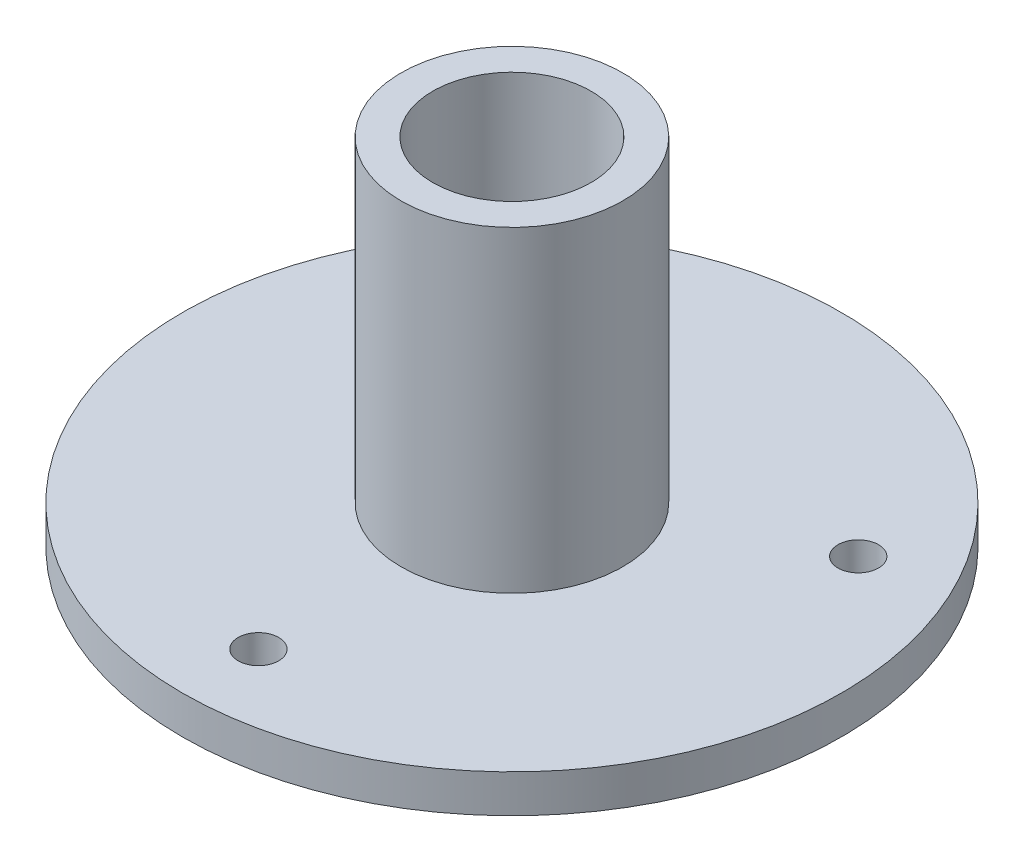
ISO-10303-21;
HEADER;
FILE_DESCRIPTION(('STEP AP214'),'2;1');
FILE_NAME('part.step','',(''),(''),'','','');
FILE_SCHEMA(('AUTOMOTIVE_DESIGN { 1 0 10303 214 1 1 1 1 }'));
ENDSEC;
DATA;
#1=APPLICATION_CONTEXT('core data for automotive mechanical design processes');
#2=APPLICATION_PROTOCOL_DEFINITION('international standard','automotive_design',2000,#1);
#3=PRODUCT_CONTEXT('',#1,'mechanical');
#4=PRODUCT('Part','Part','',(#3));
#5=PRODUCT_RELATED_PRODUCT_CATEGORY('part','',(#4));
#6=PRODUCT_DEFINITION_FORMATION('','',#4);
#7=PRODUCT_DEFINITION_CONTEXT('part definition',#1,'design');
#8=PRODUCT_DEFINITION('design','',#6,#7);
#9=PRODUCT_DEFINITION_SHAPE('','',#8);
#10=(LENGTH_UNIT() NAMED_UNIT(*) SI_UNIT(.MILLI.,.METRE.));
#11=(NAMED_UNIT(*) PLANE_ANGLE_UNIT() SI_UNIT($,.RADIAN.));
#12=(NAMED_UNIT(*) SI_UNIT($,.STERADIAN.) SOLID_ANGLE_UNIT());
#13=UNCERTAINTY_MEASURE_WITH_UNIT(LENGTH_MEASURE(1.E-05),#10,'distance_accuracy_value','');
#14=(GEOMETRIC_REPRESENTATION_CONTEXT(3) GLOBAL_UNCERTAINTY_ASSIGNED_CONTEXT((#13)) GLOBAL_UNIT_ASSIGNED_CONTEXT((#10,
#11,#12)) REPRESENTATION_CONTEXT('',''));
#15=CARTESIAN_POINT('',(0.,0.,0.));
#16=DIRECTION('',(0.,0.,1.));
#17=DIRECTION('',(1.,0.,0.));
#18=AXIS2_PLACEMENT_3D('',#15,#16,#17);
#19=CARTESIAN_POINT('',(0.,3.,0.));
#20=DIRECTION('',(0.,-1.,0.));
#21=DIRECTION('',(0.,0.,-1.));
#22=AXIS2_PLACEMENT_3D('',#19,#20,#21);
#23=CYLINDRICAL_SURFACE('',#22,26.);
#24=CARTESIAN_POINT('',(0.,3.,0.));
#25=DIRECTION('',(0.,1.,0.));
#26=DIRECTION('',(0.,0.,1.));
#27=AXIS2_PLACEMENT_3D('',#24,#25,#26);
#28=CIRCLE('',#27,26.);
#29=CARTESIAN_POINT('',(0.,3.,26.));
#30=VERTEX_POINT('',#29);
#31=EDGE_CURVE('E48',#30,#30,#28,.T.);
#32=ORIENTED_EDGE('',*,*,#31,.F.);
#33=EDGE_LOOP('',(#32));
#34=FACE_BOUND('',#33,.T.);
#35=CARTESIAN_POINT('',(0.,0.,0.));
#36=DIRECTION('',(0.,1.,0.));
#37=DIRECTION('',(0.,0.,1.));
#38=AXIS2_PLACEMENT_3D('',#35,#36,#37);
#39=CIRCLE('',#38,26.);
#40=CARTESIAN_POINT('',(0.,0.,26.));
#41=VERTEX_POINT('',#40);
#42=EDGE_CURVE('E43',#41,#41,#39,.T.);
#43=ORIENTED_EDGE('',*,*,#42,.T.);
#44=EDGE_LOOP('',(#43));
#45=FACE_BOUND('',#44,.T.);
#46=ADVANCED_FACE('F40',(#34,#45),#23,.T.);
#47=CARTESIAN_POINT('',(0.,3.,0.));
#48=DIRECTION('',(0.,1.,0.));
#49=DIRECTION('',(0.,0.,1.));
#50=AXIS2_PLACEMENT_3D('',#47,#48,#49);
#51=PLANE('',#50);
#52=CARTESIAN_POINT('',(0.,3.,20.));
#53=DIRECTION('',(0.,1.,0.));
#54=DIRECTION('',(0.,0.,1.));
#55=AXIS2_PLACEMENT_3D('',#52,#53,#54);
#56=CIRCLE('',#55,1.6);
#57=CARTESIAN_POINT('',(0.,3.,18.4));
#58=VERTEX_POINT('',#57);
#59=EDGE_CURVE('E67',#58,#58,#56,.F.);
#60=ORIENTED_EDGE('',*,*,#59,.T.);
#61=EDGE_LOOP('',(#60));
#62=FACE_BOUND('',#61,.T.);
#63=CARTESIAN_POINT('',(17.3205080756888,3.,-10.));
#64=DIRECTION('',(0.,1.,0.));
#65=DIRECTION('',(0.,0.,1.));
#66=AXIS2_PLACEMENT_3D('',#63,#64,#65);
#67=CIRCLE('',#66,1.6);
#68=CARTESIAN_POINT('',(17.3205080756888,3.,-11.6));
#69=VERTEX_POINT('',#68);
#70=EDGE_CURVE('E72',#69,#69,#67,.F.);
#71=ORIENTED_EDGE('',*,*,#70,.T.);
#72=EDGE_LOOP('',(#71));
#73=FACE_BOUND('',#72,.T.);
#74=CARTESIAN_POINT('',(-17.3205080756888,3.,-10.));
#75=DIRECTION('',(0.,1.,0.));
#76=DIRECTION('',(0.,0.,1.));
#77=AXIS2_PLACEMENT_3D('',#74,#75,#76);
#78=CIRCLE('',#77,1.6);
#79=CARTESIAN_POINT('',(-17.3205080756888,3.,-11.6));
#80=VERTEX_POINT('',#79);
#81=EDGE_CURVE('E73',#80,#80,#78,.F.);
#82=ORIENTED_EDGE('',*,*,#81,.T.);
#83=EDGE_LOOP('',(#82));
#84=FACE_BOUND('',#83,.T.);
#85=CARTESIAN_POINT('',(0.,3.,0.));
#86=DIRECTION('',(0.,1.,0.));
#87=DIRECTION('',(0.,0.,1.));
#88=AXIS2_PLACEMENT_3D('',#85,#86,#87);
#89=CIRCLE('',#88,8.75);
#90=CARTESIAN_POINT('',(0.,3.,8.75));
#91=VERTEX_POINT('',#90);
#92=EDGE_CURVE('E10',#91,#91,#89,.T.);
#93=ORIENTED_EDGE('',*,*,#92,.F.);
#94=EDGE_LOOP('',(#93));
#95=FACE_BOUND('',#94,.T.);
#96=ORIENTED_EDGE('',*,*,#31,.T.);
#97=EDGE_LOOP('',(#96));
#98=FACE_BOUND('',#97,.T.);
#99=ADVANCED_FACE('F99',(#62,#73,#84,#95,#98),#51,.T.);
#100=CARTESIAN_POINT('',(0.,0.,0.));
#101=DIRECTION('',(0.,1.,0.));
#102=DIRECTION('',(0.,0.,1.));
#103=AXIS2_PLACEMENT_3D('',#100,#101,#102);
#104=PLANE('',#103);
#105=CARTESIAN_POINT('',(0.,0.,20.));
#106=DIRECTION('',(0.,-1.,0.));
#107=DIRECTION('',(0.,0.,-1.));
#108=AXIS2_PLACEMENT_3D('',#105,#106,#107);
#109=CIRCLE('',#108,1.6);
#110=CARTESIAN_POINT('',(0.,0.,18.4));
#111=VERTEX_POINT('',#110);
#112=EDGE_CURVE('E81',#111,#111,#109,.T.);
#113=ORIENTED_EDGE('',*,*,#112,.F.);
#114=EDGE_LOOP('',(#113));
#115=FACE_BOUND('',#114,.T.);
#116=CARTESIAN_POINT('',(17.3205080756888,0.,-10.));
#117=DIRECTION('',(0.,-1.,0.));
#118=DIRECTION('',(0.,0.,-1.));
#119=AXIS2_PLACEMENT_3D('',#116,#117,#118);
#120=CIRCLE('',#119,1.6);
#121=CARTESIAN_POINT('',(17.3205080756888,0.,-11.6));
#122=VERTEX_POINT('',#121);
#123=EDGE_CURVE('E77',#122,#122,#120,.T.);
#124=ORIENTED_EDGE('',*,*,#123,.F.);
#125=EDGE_LOOP('',(#124));
#126=FACE_BOUND('',#125,.T.);
#127=CARTESIAN_POINT('',(-17.3205080756888,0.,-10.));
#128=DIRECTION('',(0.,-1.,0.));
#129=DIRECTION('',(0.,0.,-1.));
#130=AXIS2_PLACEMENT_3D('',#127,#128,#129);
#131=CIRCLE('',#130,1.6);
#132=CARTESIAN_POINT('',(-17.3205080756888,0.,-11.6));
#133=VERTEX_POINT('',#132);
#134=EDGE_CURVE('E68',#133,#133,#131,.T.);
#135=ORIENTED_EDGE('',*,*,#134,.F.);
#136=EDGE_LOOP('',(#135));
#137=FACE_BOUND('',#136,.T.);
#138=CARTESIAN_POINT('',(0.,0.,0.));
#139=DIRECTION('',(0.,1.,0.));
#140=DIRECTION('',(0.,0.,1.));
#141=AXIS2_PLACEMENT_3D('',#138,#139,#140);
#142=CIRCLE('',#141,6.25);
#143=CARTESIAN_POINT('',(0.,0.,6.25));
#144=VERTEX_POINT('',#143);
#145=EDGE_CURVE('E59',#144,#144,#142,.F.);
#146=ORIENTED_EDGE('',*,*,#145,.F.);
#147=EDGE_LOOP('',(#146));
#148=FACE_BOUND('',#147,.T.);
#149=ORIENTED_EDGE('',*,*,#42,.F.);
#150=EDGE_LOOP('',(#149));
#151=FACE_BOUND('',#150,.T.);
#152=ADVANCED_FACE('F95',(#115,#126,#137,#148,#151),#104,.F.);
#153=CARTESIAN_POINT('',(0.,28.,0.));
#154=DIRECTION('',(0.,-1.,0.));
#155=DIRECTION('',(0.,0.,-1.));
#156=AXIS2_PLACEMENT_3D('',#153,#154,#155);
#157=CYLINDRICAL_SURFACE('',#156,8.75);
#158=CARTESIAN_POINT('',(0.,28.,0.));
#159=DIRECTION('',(0.,1.,0.));
#160=DIRECTION('',(0.,0.,1.));
#161=AXIS2_PLACEMENT_3D('',#158,#159,#160);
#162=CIRCLE('',#161,8.75);
#163=CARTESIAN_POINT('',(0.,28.,8.75));
#164=VERTEX_POINT('',#163);
#165=EDGE_CURVE('E55',#164,#164,#162,.T.);
#166=ORIENTED_EDGE('',*,*,#165,.F.);
#167=EDGE_LOOP('',(#166));
#168=FACE_BOUND('',#167,.T.);
#169=ORIENTED_EDGE('',*,*,#92,.T.);
#170=EDGE_LOOP('',(#169));
#171=FACE_BOUND('',#170,.T.);
#172=ADVANCED_FACE('F98',(#168,#171),#157,.T.);
#173=CARTESIAN_POINT('',(0.,28.,0.));
#174=DIRECTION('',(0.,1.,0.));
#175=DIRECTION('',(0.,0.,1.));
#176=AXIS2_PLACEMENT_3D('',#173,#174,#175);
#177=PLANE('',#176);
#178=CARTESIAN_POINT('',(0.,28.,0.));
#179=DIRECTION('',(0.,1.,0.));
#180=DIRECTION('',(0.,0.,1.));
#181=AXIS2_PLACEMENT_3D('',#178,#179,#180);
#182=CIRCLE('',#181,6.25);
#183=CARTESIAN_POINT('',(0.,28.,6.25));
#184=VERTEX_POINT('',#183);
#185=EDGE_CURVE('E63',#184,#184,#182,.T.);
#186=ORIENTED_EDGE('',*,*,#185,.F.);
#187=EDGE_LOOP('',(#186));
#188=FACE_BOUND('',#187,.T.);
#189=ORIENTED_EDGE('',*,*,#165,.T.);
#190=EDGE_LOOP('',(#189));
#191=FACE_BOUND('',#190,.T.);
#192=ADVANCED_FACE('F125',(#188,#191),#177,.T.);
#193=CARTESIAN_POINT('',(0.,-17.6776695296637,0.));
#194=DIRECTION('',(0.,1.,0.));
#195=DIRECTION('',(0.,0.,1.));
#196=AXIS2_PLACEMENT_3D('',#193,#194,#195);
#197=CYLINDRICAL_SURFACE('',#196,6.25);
#198=ORIENTED_EDGE('',*,*,#145,.T.);
#199=EDGE_LOOP('',(#198));
#200=FACE_BOUND('',#199,.T.);
#201=ORIENTED_EDGE('',*,*,#185,.T.);
#202=EDGE_LOOP('',(#201));
#203=FACE_BOUND('',#202,.T.);
#204=ADVANCED_FACE('F129',(#200,#203),#197,.F.);
#205=CARTESIAN_POINT('',(-17.3205080756888,7.52548339959391,-10.));
#206=DIRECTION('',(0.,-1.,0.));
#207=DIRECTION('',(0.,0.,-1.));
#208=AXIS2_PLACEMENT_3D('',#205,#206,#207);
#209=CYLINDRICAL_SURFACE('',#208,1.6);
#210=CARTESIAN_POINT('',(-17.3205080756888,0.,-11.6));
#211=CARTESIAN_POINT('',(-17.3205080756888,0.03125,-11.6));
#212=CARTESIAN_POINT('',(-17.3205080756888,0.0625000000000001,-11.6));
#213=CARTESIAN_POINT('',(-17.3205080756888,0.125,-11.6));
#214=CARTESIAN_POINT('',(-17.3205080756888,0.15625,-11.6));
#215=CARTESIAN_POINT('',(-17.3205080756888,0.21875,-11.6));
#216=CARTESIAN_POINT('',(-17.3205080756888,0.25,-11.6));
#217=CARTESIAN_POINT('',(-17.3205080756888,0.3125,-11.6));
#218=CARTESIAN_POINT('',(-17.3205080756888,0.34375,-11.6));
#219=CARTESIAN_POINT('',(-17.3205080756888,0.40625,-11.6));
#220=CARTESIAN_POINT('',(-17.3205080756888,0.4375,-11.6));
#221=CARTESIAN_POINT('',(-17.3205080756888,0.5,-11.6));
#222=CARTESIAN_POINT('',(-17.3205080756888,0.53125,-11.6));
#223=CARTESIAN_POINT('',(-17.3205080756888,0.59375,-11.6));
#224=CARTESIAN_POINT('',(-17.3205080756888,0.625,-11.6));
#225=CARTESIAN_POINT('',(-17.3205080756888,0.6875,-11.6));
#226=CARTESIAN_POINT('',(-17.3205080756888,0.71875,-11.6));
#227=CARTESIAN_POINT('',(-17.3205080756888,0.78125,-11.6));
#228=CARTESIAN_POINT('',(-17.3205080756888,0.8125,-11.6));
#229=CARTESIAN_POINT('',(-17.3205080756888,0.875,-11.6));
#230=CARTESIAN_POINT('',(-17.3205080756888,0.90625,-11.6));
#231=CARTESIAN_POINT('',(-17.3205080756888,0.96875,-11.6));
#232=CARTESIAN_POINT('',(-17.3205080756888,0.999999999999999,-11.6));
#233=CARTESIAN_POINT('',(-17.3205080756888,1.0625,-11.6));
#234=CARTESIAN_POINT('',(-17.3205080756888,1.09375,-11.6));
#235=CARTESIAN_POINT('',(-17.3205080756888,1.15625,-11.6));
#236=CARTESIAN_POINT('',(-17.3205080756888,1.1875,-11.6));
#237=CARTESIAN_POINT('',(-17.3205080756888,1.25,-11.6));
#238=CARTESIAN_POINT('',(-17.3205080756888,1.28125,-11.6));
#239=CARTESIAN_POINT('',(-17.3205080756888,1.34375,-11.6));
#240=CARTESIAN_POINT('',(-17.3205080756888,1.375,-11.6));
#241=CARTESIAN_POINT('',(-17.3205080756888,1.4375,-11.6));
#242=CARTESIAN_POINT('',(-17.3205080756888,1.46875,-11.6));
#243=CARTESIAN_POINT('',(-17.3205080756888,1.53125,-11.6));
#244=CARTESIAN_POINT('',(-17.3205080756888,1.5625,-11.6));
#245=CARTESIAN_POINT('',(-17.3205080756888,1.625,-11.6));
#246=CARTESIAN_POINT('',(-17.3205080756888,1.65625,-11.6));
#247=CARTESIAN_POINT('',(-17.3205080756888,1.71875,-11.6));
#248=CARTESIAN_POINT('',(-17.3205080756888,1.75,-11.6));
#249=CARTESIAN_POINT('',(-17.3205080756888,1.8125,-11.6));
#250=CARTESIAN_POINT('',(-17.3205080756888,1.84375,-11.6));
#251=CARTESIAN_POINT('',(-17.3205080756888,1.90625,-11.6));
#252=CARTESIAN_POINT('',(-17.3205080756888,1.9375,-11.6));
#253=CARTESIAN_POINT('',(-17.3205080756888,2.,-11.6));
#254=CARTESIAN_POINT('',(-17.3205080756888,2.03125,-11.6));
#255=CARTESIAN_POINT('',(-17.3205080756888,2.09375,-11.6));
#256=CARTESIAN_POINT('',(-17.3205080756888,2.125,-11.6));
#257=CARTESIAN_POINT('',(-17.3205080756888,2.1875,-11.6));
#258=CARTESIAN_POINT('',(-17.3205080756888,2.21875,-11.6));
#259=CARTESIAN_POINT('',(-17.3205080756888,2.28125,-11.6));
#260=CARTESIAN_POINT('',(-17.3205080756888,2.3125,-11.6));
#261=CARTESIAN_POINT('',(-17.3205080756888,2.375,-11.6));
#262=CARTESIAN_POINT('',(-17.3205080756888,2.40625,-11.6));
#263=CARTESIAN_POINT('',(-17.3205080756888,2.46875,-11.6));
#264=CARTESIAN_POINT('',(-17.3205080756888,2.5,-11.6));
#265=CARTESIAN_POINT('',(-17.3205080756888,2.5625,-11.6));
#266=CARTESIAN_POINT('',(-17.3205080756888,2.59375,-11.6));
#267=CARTESIAN_POINT('',(-17.3205080756888,2.65625,-11.6));
#268=CARTESIAN_POINT('',(-17.3205080756888,2.6875,-11.6));
#269=CARTESIAN_POINT('',(-17.3205080756888,2.75,-11.6));
#270=CARTESIAN_POINT('',(-17.3205080756888,2.78125,-11.6));
#271=CARTESIAN_POINT('',(-17.3205080756888,2.84375,-11.6));
#272=CARTESIAN_POINT('',(-17.3205080756888,2.875,-11.6));
#273=CARTESIAN_POINT('',(-17.3205080756888,2.9375,-11.6));
#274=CARTESIAN_POINT('',(-17.3205080756888,2.96875,-11.6));
#275=CARTESIAN_POINT('',(-17.3205080756888,3.,-11.6));
#276=B_SPLINE_CURVE_WITH_KNOTS('',3,(#210,#211,#212,#213,#214,#215,#216,#217,#218,#219,#220,
#221,#222,#223,#224,#225,#226,#227,#228,#229,#230,#231,#232,#233,#234,#235,#236,#237,#238,#239,
#240,#241,#242,#243,#244,#245,#246,#247,#248,#249,#250,#251,#252,#253,#254,#255,#256,#257,#258,
#259,#260,#261,#262,#263,#264,#265,#266,#267,#268,#269,#270,#271,#272,#273,#274,#275),
.UNSPECIFIED.,.F.,.F.,(4,2,2,2,2,2,2,2,2,2,2,2,2,2,2,2,2,2,2,2,2,2,2,2,2,2,2,2,2,2,2,2,4),(0.,
0.0937500000000001,0.1875,0.28125,0.375,0.46875,0.5625,0.65625,0.75,0.84375,0.9375,1.03125,
1.125,1.21875,1.3125,1.40625,1.5,1.59375,1.6875,1.78125,1.875,1.96875,2.0625,2.15625,2.25,
2.34375,2.4375,2.53125,2.625,2.71875,2.8125,2.90625,3.),.UNSPECIFIED.);
#277=EDGE_CURVE('BSEAM133',#133,#80,#276,.T.);
#278=ORIENTED_EDGE('',*,*,#134,.T.);
#279=ORIENTED_EDGE('',*,*,#81,.F.);
#280=ORIENTED_EDGE('',*,*,#277,.T.);
#281=ORIENTED_EDGE('',*,*,#277,.F.);
#282=EDGE_LOOP('',(#278,#280,#279,#281));
#283=FACE_BOUND('',#282,.T.);
#284=ADVANCED_FACE('F133',(#283),#209,.F.);
#285=CARTESIAN_POINT('',(17.3205080756888,7.52548339959391,-10.));
#286=DIRECTION('',(0.,-1.,0.));
#287=DIRECTION('',(0.,0.,-1.));
#288=AXIS2_PLACEMENT_3D('',#285,#286,#287);
#289=CYLINDRICAL_SURFACE('',#288,1.6);
#290=CARTESIAN_POINT('',(17.3205080756888,0.,-11.6));
#291=CARTESIAN_POINT('',(17.3205080756888,0.03125,-11.6));
#292=CARTESIAN_POINT('',(17.3205080756888,0.0625000000000001,-11.6));
#293=CARTESIAN_POINT('',(17.3205080756888,0.125,-11.6));
#294=CARTESIAN_POINT('',(17.3205080756888,0.15625,-11.6));
#295=CARTESIAN_POINT('',(17.3205080756888,0.21875,-11.6));
#296=CARTESIAN_POINT('',(17.3205080756888,0.25,-11.6));
#297=CARTESIAN_POINT('',(17.3205080756888,0.3125,-11.6));
#298=CARTESIAN_POINT('',(17.3205080756888,0.34375,-11.6));
#299=CARTESIAN_POINT('',(17.3205080756888,0.40625,-11.6));
#300=CARTESIAN_POINT('',(17.3205080756888,0.4375,-11.6));
#301=CARTESIAN_POINT('',(17.3205080756888,0.5,-11.6));
#302=CARTESIAN_POINT('',(17.3205080756888,0.53125,-11.6));
#303=CARTESIAN_POINT('',(17.3205080756888,0.59375,-11.6));
#304=CARTESIAN_POINT('',(17.3205080756888,0.625,-11.6));
#305=CARTESIAN_POINT('',(17.3205080756888,0.6875,-11.6));
#306=CARTESIAN_POINT('',(17.3205080756888,0.71875,-11.6));
#307=CARTESIAN_POINT('',(17.3205080756888,0.78125,-11.6));
#308=CARTESIAN_POINT('',(17.3205080756888,0.8125,-11.6));
#309=CARTESIAN_POINT('',(17.3205080756888,0.875,-11.6));
#310=CARTESIAN_POINT('',(17.3205080756888,0.90625,-11.6));
#311=CARTESIAN_POINT('',(17.3205080756888,0.96875,-11.6));
#312=CARTESIAN_POINT('',(17.3205080756888,0.999999999999999,-11.6));
#313=CARTESIAN_POINT('',(17.3205080756888,1.0625,-11.6));
#314=CARTESIAN_POINT('',(17.3205080756888,1.09375,-11.6));
#315=CARTESIAN_POINT('',(17.3205080756888,1.15625,-11.6));
#316=CARTESIAN_POINT('',(17.3205080756888,1.1875,-11.6));
#317=CARTESIAN_POINT('',(17.3205080756888,1.25,-11.6));
#318=CARTESIAN_POINT('',(17.3205080756888,1.28125,-11.6));
#319=CARTESIAN_POINT('',(17.3205080756888,1.34375,-11.6));
#320=CARTESIAN_POINT('',(17.3205080756888,1.375,-11.6));
#321=CARTESIAN_POINT('',(17.3205080756888,1.4375,-11.6));
#322=CARTESIAN_POINT('',(17.3205080756888,1.46875,-11.6));
#323=CARTESIAN_POINT('',(17.3205080756888,1.53125,-11.6));
#324=CARTESIAN_POINT('',(17.3205080756888,1.5625,-11.6));
#325=CARTESIAN_POINT('',(17.3205080756888,1.625,-11.6));
#326=CARTESIAN_POINT('',(17.3205080756888,1.65625,-11.6));
#327=CARTESIAN_POINT('',(17.3205080756888,1.71875,-11.6));
#328=CARTESIAN_POINT('',(17.3205080756888,1.75,-11.6));
#329=CARTESIAN_POINT('',(17.3205080756888,1.8125,-11.6));
#330=CARTESIAN_POINT('',(17.3205080756888,1.84375,-11.6));
#331=CARTESIAN_POINT('',(17.3205080756888,1.90625,-11.6));
#332=CARTESIAN_POINT('',(17.3205080756888,1.9375,-11.6));
#333=CARTESIAN_POINT('',(17.3205080756888,2.,-11.6));
#334=CARTESIAN_POINT('',(17.3205080756888,2.03125,-11.6));
#335=CARTESIAN_POINT('',(17.3205080756888,2.09375,-11.6));
#336=CARTESIAN_POINT('',(17.3205080756888,2.125,-11.6));
#337=CARTESIAN_POINT('',(17.3205080756888,2.1875,-11.6));
#338=CARTESIAN_POINT('',(17.3205080756888,2.21875,-11.6));
#339=CARTESIAN_POINT('',(17.3205080756888,2.28125,-11.6));
#340=CARTESIAN_POINT('',(17.3205080756888,2.3125,-11.6));
#341=CARTESIAN_POINT('',(17.3205080756888,2.375,-11.6));
#342=CARTESIAN_POINT('',(17.3205080756888,2.40625,-11.6));
#343=CARTESIAN_POINT('',(17.3205080756888,2.46875,-11.6));
#344=CARTESIAN_POINT('',(17.3205080756888,2.5,-11.6));
#345=CARTESIAN_POINT('',(17.3205080756888,2.5625,-11.6));
#346=CARTESIAN_POINT('',(17.3205080756888,2.59375,-11.6));
#347=CARTESIAN_POINT('',(17.3205080756888,2.65625,-11.6));
#348=CARTESIAN_POINT('',(17.3205080756888,2.6875,-11.6));
#349=CARTESIAN_POINT('',(17.3205080756888,2.75,-11.6));
#350=CARTESIAN_POINT('',(17.3205080756888,2.78125,-11.6));
#351=CARTESIAN_POINT('',(17.3205080756888,2.84375,-11.6));
#352=CARTESIAN_POINT('',(17.3205080756888,2.875,-11.6));
#353=CARTESIAN_POINT('',(17.3205080756888,2.9375,-11.6));
#354=CARTESIAN_POINT('',(17.3205080756888,2.96875,-11.6));
#355=CARTESIAN_POINT('',(17.3205080756888,3.,-11.6));
#356=B_SPLINE_CURVE_WITH_KNOTS('',3,(#290,#291,#292,#293,#294,#295,#296,#297,#298,#299,#300,
#301,#302,#303,#304,#305,#306,#307,#308,#309,#310,#311,#312,#313,#314,#315,#316,#317,#318,#319,
#320,#321,#322,#323,#324,#325,#326,#327,#328,#329,#330,#331,#332,#333,#334,#335,#336,#337,#338,
#339,#340,#341,#342,#343,#344,#345,#346,#347,#348,#349,#350,#351,#352,#353,#354,#355),
.UNSPECIFIED.,.F.,.F.,(4,2,2,2,2,2,2,2,2,2,2,2,2,2,2,2,2,2,2,2,2,2,2,2,2,2,2,2,2,2,2,2,4),(0.,
0.0937500000000001,0.1875,0.28125,0.375,0.46875,0.5625,0.65625,0.75,0.84375,0.9375,1.03125,
1.125,1.21875,1.3125,1.40625,1.5,1.59375,1.6875,1.78125,1.875,1.96875,2.0625,2.15625,2.25,
2.34375,2.4375,2.53125,2.625,2.71875,2.8125,2.90625,3.),.UNSPECIFIED.);
#357=EDGE_CURVE('BSEAM137',#122,#69,#356,.T.);
#358=ORIENTED_EDGE('',*,*,#123,.T.);
#359=ORIENTED_EDGE('',*,*,#70,.F.);
#360=ORIENTED_EDGE('',*,*,#357,.T.);
#361=ORIENTED_EDGE('',*,*,#357,.F.);
#362=EDGE_LOOP('',(#358,#360,#359,#361));
#363=FACE_BOUND('',#362,.T.);
#364=ADVANCED_FACE('F137',(#363),#289,.F.);
#365=CARTESIAN_POINT('',(0.,7.52548339959391,20.));
#366=DIRECTION('',(0.,-1.,0.));
#367=DIRECTION('',(0.,0.,-1.));
#368=AXIS2_PLACEMENT_3D('',#365,#366,#367);
#369=CYLINDRICAL_SURFACE('',#368,1.6);
#370=CARTESIAN_POINT('',(0.,0.,18.4));
#371=CARTESIAN_POINT('',(0.,0.03125,18.4));
#372=CARTESIAN_POINT('',(0.,0.0625000000000001,18.4));
#373=CARTESIAN_POINT('',(0.,0.125,18.4));
#374=CARTESIAN_POINT('',(0.,0.15625,18.4));
#375=CARTESIAN_POINT('',(0.,0.21875,18.4));
#376=CARTESIAN_POINT('',(0.,0.25,18.4));
#377=CARTESIAN_POINT('',(0.,0.3125,18.4));
#378=CARTESIAN_POINT('',(0.,0.34375,18.4));
#379=CARTESIAN_POINT('',(0.,0.40625,18.4));
#380=CARTESIAN_POINT('',(0.,0.4375,18.4));
#381=CARTESIAN_POINT('',(0.,0.5,18.4));
#382=CARTESIAN_POINT('',(0.,0.53125,18.4));
#383=CARTESIAN_POINT('',(0.,0.59375,18.4));
#384=CARTESIAN_POINT('',(0.,0.625,18.4));
#385=CARTESIAN_POINT('',(0.,0.6875,18.4));
#386=CARTESIAN_POINT('',(0.,0.71875,18.4));
#387=CARTESIAN_POINT('',(0.,0.78125,18.4));
#388=CARTESIAN_POINT('',(0.,0.8125,18.4));
#389=CARTESIAN_POINT('',(0.,0.875,18.4));
#390=CARTESIAN_POINT('',(0.,0.90625,18.4));
#391=CARTESIAN_POINT('',(0.,0.96875,18.4));
#392=CARTESIAN_POINT('',(0.,0.999999999999999,18.4));
#393=CARTESIAN_POINT('',(0.,1.0625,18.4));
#394=CARTESIAN_POINT('',(0.,1.09375,18.4));
#395=CARTESIAN_POINT('',(0.,1.15625,18.4));
#396=CARTESIAN_POINT('',(0.,1.1875,18.4));
#397=CARTESIAN_POINT('',(0.,1.25,18.4));
#398=CARTESIAN_POINT('',(0.,1.28125,18.4));
#399=CARTESIAN_POINT('',(0.,1.34375,18.4));
#400=CARTESIAN_POINT('',(0.,1.375,18.4));
#401=CARTESIAN_POINT('',(0.,1.4375,18.4));
#402=CARTESIAN_POINT('',(0.,1.46875,18.4));
#403=CARTESIAN_POINT('',(0.,1.53125,18.4));
#404=CARTESIAN_POINT('',(0.,1.5625,18.4));
#405=CARTESIAN_POINT('',(0.,1.625,18.4));
#406=CARTESIAN_POINT('',(0.,1.65625,18.4));
#407=CARTESIAN_POINT('',(0.,1.71875,18.4));
#408=CARTESIAN_POINT('',(0.,1.75,18.4));
#409=CARTESIAN_POINT('',(0.,1.8125,18.4));
#410=CARTESIAN_POINT('',(0.,1.84375,18.4));
#411=CARTESIAN_POINT('',(0.,1.90625,18.4));
#412=CARTESIAN_POINT('',(0.,1.9375,18.4));
#413=CARTESIAN_POINT('',(0.,2.,18.4));
#414=CARTESIAN_POINT('',(0.,2.03125,18.4));
#415=CARTESIAN_POINT('',(0.,2.09375,18.4));
#416=CARTESIAN_POINT('',(0.,2.125,18.4));
#417=CARTESIAN_POINT('',(0.,2.1875,18.4));
#418=CARTESIAN_POINT('',(0.,2.21875,18.4));
#419=CARTESIAN_POINT('',(0.,2.28125,18.4));
#420=CARTESIAN_POINT('',(0.,2.3125,18.4));
#421=CARTESIAN_POINT('',(0.,2.375,18.4));
#422=CARTESIAN_POINT('',(0.,2.40625,18.4));
#423=CARTESIAN_POINT('',(0.,2.46875,18.4));
#424=CARTESIAN_POINT('',(0.,2.5,18.4));
#425=CARTESIAN_POINT('',(0.,2.5625,18.4));
#426=CARTESIAN_POINT('',(0.,2.59375,18.4));
#427=CARTESIAN_POINT('',(0.,2.65625,18.4));
#428=CARTESIAN_POINT('',(0.,2.6875,18.4));
#429=CARTESIAN_POINT('',(0.,2.75,18.4));
#430=CARTESIAN_POINT('',(0.,2.78125,18.4));
#431=CARTESIAN_POINT('',(0.,2.84375,18.4));
#432=CARTESIAN_POINT('',(0.,2.875,18.4));
#433=CARTESIAN_POINT('',(0.,2.9375,18.4));
#434=CARTESIAN_POINT('',(0.,2.96875,18.4));
#435=CARTESIAN_POINT('',(0.,3.,18.4));
#436=B_SPLINE_CURVE_WITH_KNOTS('',3,(#370,#371,#372,#373,#374,#375,#376,#377,#378,#379,#380,
#381,#382,#383,#384,#385,#386,#387,#388,#389,#390,#391,#392,#393,#394,#395,#396,#397,#398,#399,
#400,#401,#402,#403,#404,#405,#406,#407,#408,#409,#410,#411,#412,#413,#414,#415,#416,#417,#418,
#419,#420,#421,#422,#423,#424,#425,#426,#427,#428,#429,#430,#431,#432,#433,#434,#435),
.UNSPECIFIED.,.F.,.F.,(4,2,2,2,2,2,2,2,2,2,2,2,2,2,2,2,2,2,2,2,2,2,2,2,2,2,2,2,2,2,2,2,4),(0.,
0.0937500000000001,0.1875,0.28125,0.375,0.46875,0.5625,0.65625,0.75,0.84375,0.9375,1.03125,
1.125,1.21875,1.3125,1.40625,1.5,1.59375,1.6875,1.78125,1.875,1.96875,2.0625,2.15625,2.25,
2.34375,2.4375,2.53125,2.625,2.71875,2.8125,2.90625,3.),.UNSPECIFIED.);
#437=EDGE_CURVE('BSEAM92',#111,#58,#436,.T.);
#438=ORIENTED_EDGE('',*,*,#112,.T.);
#439=ORIENTED_EDGE('',*,*,#59,.F.);
#440=ORIENTED_EDGE('',*,*,#437,.T.);
#441=ORIENTED_EDGE('',*,*,#437,.F.);
#442=EDGE_LOOP('',(#438,#440,#439,#441));
#443=FACE_BOUND('',#442,.T.);
#444=ADVANCED_FACE('F92',(#443),#369,.F.);
#445=CLOSED_SHELL('',(#46,#99,#152,#172,#192,#204,#284,#364,#444));
#446=MANIFOLD_SOLID_BREP('B2',#445);
#447=ADVANCED_BREP_SHAPE_REPRESENTATION('',(#18,#446),#14);
#448=SHAPE_DEFINITION_REPRESENTATION(#9,#447);
ENDSEC;
END-ISO-10303-21;
